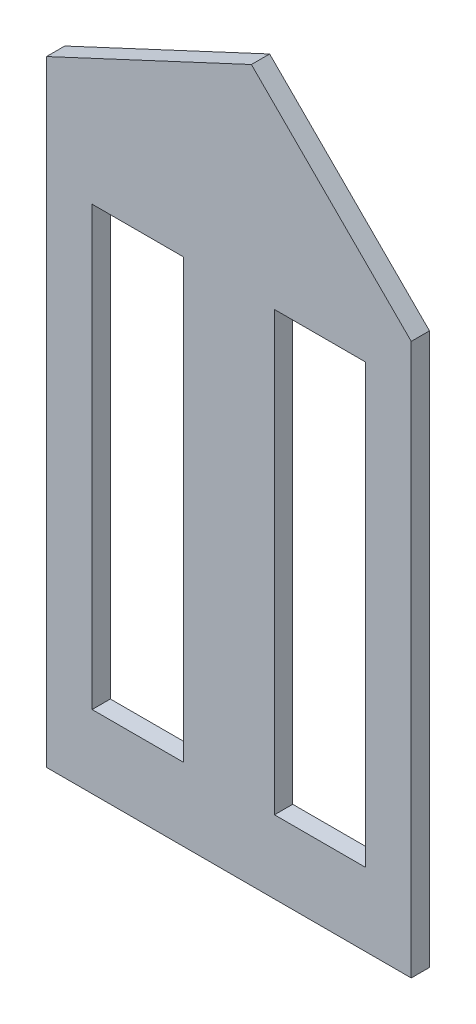
ISO-10303-21;
HEADER;
FILE_DESCRIPTION(('STEP AP214'),'2;1');
FILE_NAME('part.step','',(''),(''),'','','');
FILE_SCHEMA(('AUTOMOTIVE_DESIGN { 1 0 10303 214 1 1 1 1 }'));
ENDSEC;
DATA;
#1=APPLICATION_CONTEXT('core data for automotive mechanical design processes');
#2=APPLICATION_PROTOCOL_DEFINITION('international standard','automotive_design',2000,#1);
#3=PRODUCT_CONTEXT('',#1,'mechanical');
#4=PRODUCT('Part','Part','',(#3));
#5=PRODUCT_RELATED_PRODUCT_CATEGORY('part','',(#4));
#6=PRODUCT_DEFINITION_FORMATION('','',#4);
#7=PRODUCT_DEFINITION_CONTEXT('part definition',#1,'design');
#8=PRODUCT_DEFINITION('design','',#6,#7);
#9=PRODUCT_DEFINITION_SHAPE('','',#8);
#10=(LENGTH_UNIT() NAMED_UNIT(*) SI_UNIT(.MILLI.,.METRE.));
#11=(NAMED_UNIT(*) PLANE_ANGLE_UNIT() SI_UNIT($,.RADIAN.));
#12=(NAMED_UNIT(*) SI_UNIT($,.STERADIAN.) SOLID_ANGLE_UNIT());
#13=UNCERTAINTY_MEASURE_WITH_UNIT(LENGTH_MEASURE(1.E-05),#10,'distance_accuracy_value','');
#14=(GEOMETRIC_REPRESENTATION_CONTEXT(3) GLOBAL_UNCERTAINTY_ASSIGNED_CONTEXT((#13)) GLOBAL_UNIT_ASSIGNED_CONTEXT((#10,
#11,#12)) REPRESENTATION_CONTEXT('',''));
#15=CARTESIAN_POINT('',(0.,0.,0.));
#16=DIRECTION('',(0.,0.,1.));
#17=DIRECTION('',(1.,0.,0.));
#18=AXIS2_PLACEMENT_3D('',#15,#16,#17);
#19=CARTESIAN_POINT('',(0.,0.,6.35));
#20=DIRECTION('',(1.,0.,0.));
#21=DIRECTION('',(0.,0.,-1.));
#22=AXIS2_PLACEMENT_3D('',#19,#20,#21);
#23=PLANE('',#22);
#24=DIRECTION('',(0.,0.,1.));
#25=VECTOR('',#24,1.);
#26=CARTESIAN_POINT('',(0.,214.383772574386,0.));
#27=LINE('',#26,#25);
#28=CARTESIAN_POINT('',(0.,214.383772574386,0.));
#29=VERTEX_POINT('',#28);
#30=CARTESIAN_POINT('',(0.,214.383772574386,6.35));
#31=VERTEX_POINT('',#30);
#32=EDGE_CURVE('E229',#29,#31,#27,.T.);
#33=ORIENTED_EDGE('',*,*,#32,.F.);
#34=DIRECTION('',(0.,-1.,0.));
#35=VECTOR('',#34,1.);
#36=CARTESIAN_POINT('',(0.,0.,0.));
#37=LINE('',#36,#35);
#38=CARTESIAN_POINT('',(0.,0.,0.));
#39=VERTEX_POINT('',#38);
#40=EDGE_CURVE('E231',#29,#39,#37,.T.);
#41=ORIENTED_EDGE('',*,*,#40,.T.);
#42=DIRECTION('',(0.,0.,-1.));
#43=VECTOR('',#42,1.);
#44=CARTESIAN_POINT('',(0.,0.,6.35));
#45=LINE('',#44,#43);
#46=CARTESIAN_POINT('',(0.,0.,6.35));
#47=VERTEX_POINT('',#46);
#48=EDGE_CURVE('E12',#47,#39,#45,.T.);
#49=ORIENTED_EDGE('',*,*,#48,.F.);
#50=DIRECTION('',(0.,-1.,0.));
#51=VECTOR('',#50,1.);
#52=CARTESIAN_POINT('',(0.,0.,6.35));
#53=LINE('',#52,#51);
#54=EDGE_CURVE('E233',#31,#47,#53,.T.);
#55=ORIENTED_EDGE('',*,*,#54,.F.);
#56=EDGE_LOOP('',(#33,#41,#49,#55));
#57=FACE_BOUND('',#56,.T.);
#58=ADVANCED_FACE('F52',(#57),#23,.F.);
#59=CARTESIAN_POINT('',(0.,0.,6.35));
#60=DIRECTION('',(0.,0.,-1.));
#61=DIRECTION('',(-1.,0.,0.));
#62=AXIS2_PLACEMENT_3D('',#59,#60,#61);
#63=PLANE('',#62);
#64=DIRECTION('',(1.,0.,0.));
#65=VECTOR('',#64,1.);
#66=CARTESIAN_POINT('',(15.875,25.4,6.35));
#67=LINE('',#66,#65);
#68=CARTESIAN_POINT('',(15.875,25.4,6.35));
#69=VERTEX_POINT('',#68);
#70=CARTESIAN_POINT('',(47.625,25.4,6.35));
#71=VERTEX_POINT('',#70);
#72=EDGE_CURVE('E176',#69,#71,#67,.T.);
#73=ORIENTED_EDGE('',*,*,#72,.F.);
#74=DIRECTION('',(0.,-1.,0.));
#75=VECTOR('',#74,1.);
#76=CARTESIAN_POINT('',(15.875,177.8,6.35));
#77=LINE('',#76,#75);
#78=CARTESIAN_POINT('',(15.875,177.8,6.35));
#79=VERTEX_POINT('',#78);
#80=EDGE_CURVE('E66',#79,#69,#77,.T.);
#81=ORIENTED_EDGE('',*,*,#80,.F.);
#82=DIRECTION('',(-1.,0.,0.));
#83=VECTOR('',#82,1.);
#84=CARTESIAN_POINT('',(15.875,177.8,6.35));
#85=LINE('',#84,#83);
#86=CARTESIAN_POINT('',(47.625,177.8,6.35));
#87=VERTEX_POINT('',#86);
#88=EDGE_CURVE('E167',#87,#79,#85,.T.);
#89=ORIENTED_EDGE('',*,*,#88,.F.);
#90=DIRECTION('',(0.,1.,0.));
#91=VECTOR('',#90,1.);
#92=CARTESIAN_POINT('',(47.625,177.8,6.35));
#93=LINE('',#92,#91);
#94=EDGE_CURVE('E170',#71,#87,#93,.T.);
#95=ORIENTED_EDGE('',*,*,#94,.F.);
#96=EDGE_LOOP('',(#73,#81,#89,#95));
#97=FACE_BOUND('',#96,.T.);
#98=DIRECTION('',(1.,0.,0.));
#99=VECTOR('',#98,1.);
#100=CARTESIAN_POINT('',(79.375,25.4,6.35));
#101=LINE('',#100,#99);
#102=CARTESIAN_POINT('',(79.375,25.4,6.35));
#103=VERTEX_POINT('',#102);
#104=CARTESIAN_POINT('',(111.125,25.4,6.35));
#105=VERTEX_POINT('',#104);
#106=EDGE_CURVE('E202',#103,#105,#101,.T.);
#107=ORIENTED_EDGE('',*,*,#106,.F.);
#108=DIRECTION('',(0.,-1.,0.));
#109=VECTOR('',#108,1.);
#110=CARTESIAN_POINT('',(79.375,177.8,6.35));
#111=LINE('',#110,#109);
#112=CARTESIAN_POINT('',(79.375,177.8,6.35));
#113=VERTEX_POINT('',#112);
#114=EDGE_CURVE('E74',#113,#103,#111,.T.);
#115=ORIENTED_EDGE('',*,*,#114,.F.);
#116=DIRECTION('',(-1.,0.,0.));
#117=VECTOR('',#116,1.);
#118=CARTESIAN_POINT('',(79.375,177.8,6.35));
#119=LINE('',#118,#117);
#120=CARTESIAN_POINT('',(111.125,177.8,6.35));
#121=VERTEX_POINT('',#120);
#122=EDGE_CURVE('E191',#121,#113,#119,.T.);
#123=ORIENTED_EDGE('',*,*,#122,.F.);
#124=DIRECTION('',(0.,1.,0.));
#125=VECTOR('',#124,1.);
#126=CARTESIAN_POINT('',(111.125,177.8,6.35));
#127=LINE('',#126,#125);
#128=EDGE_CURVE('E205',#105,#121,#127,.T.);
#129=ORIENTED_EDGE('',*,*,#128,.F.);
#130=EDGE_LOOP('',(#107,#115,#123,#129));
#131=FACE_BOUND('',#130,.T.);
#132=DIRECTION('',(0.,1.,0.));
#133=VECTOR('',#132,1.);
#134=CARTESIAN_POINT('',(127.,0.,6.35));
#135=LINE('',#134,#133);
#136=CARTESIAN_POINT('',(127.,0.,6.35));
#137=VERTEX_POINT('',#136);
#138=CARTESIAN_POINT('',(127.,191.989654933476,6.35));
#139=VERTEX_POINT('',#138);
#140=EDGE_CURVE('E238',#137,#139,#135,.T.);
#141=ORIENTED_EDGE('',*,*,#140,.T.);
#142=DIRECTION('',(0.707106781186552,-0.707106781186544,0.));
#143=VECTOR('',#142,1.);
#144=CARTESIAN_POINT('',(159.494827466737,159.494827466739,6.35));
#145=LINE('',#144,#143);
#146=CARTESIAN_POINT('',(71.3396549334752,247.65,6.35));
#147=VERTEX_POINT('',#146);
#148=EDGE_CURVE('E183',#147,#139,#145,.T.);
#149=ORIENTED_EDGE('',*,*,#148,.F.);
#150=DIRECTION('',(-0.906307787036653,-0.422618261740693,0.));
#151=VECTOR('',#150,1.);
#152=CARTESIAN_POINT('',(-82.1137488377447,176.09350265153,6.35));
#153=LINE('',#152,#151);
#154=EDGE_CURVE('E223',#147,#31,#153,.T.);
#155=ORIENTED_EDGE('',*,*,#154,.T.);
#156=ORIENTED_EDGE('',*,*,#54,.T.);
#157=DIRECTION('',(1.,0.,0.));
#158=VECTOR('',#157,1.);
#159=CARTESIAN_POINT('',(0.,0.,6.35));
#160=LINE('',#159,#158);
#161=EDGE_CURVE('E235',#47,#137,#160,.T.);
#162=ORIENTED_EDGE('',*,*,#161,.T.);
#163=EDGE_LOOP('',(#141,#149,#155,#156,#162));
#164=FACE_BOUND('',#163,.T.);
#165=ADVANCED_FACE('F267',(#97,#131,#164),#63,.F.);
#166=CARTESIAN_POINT('',(0.,0.,0.));
#167=DIRECTION('',(0.,0.,-1.));
#168=DIRECTION('',(-1.,0.,0.));
#169=AXIS2_PLACEMENT_3D('',#166,#167,#168);
#170=PLANE('',#169);
#171=DIRECTION('',(0.,-1.,0.));
#172=VECTOR('',#171,1.);
#173=CARTESIAN_POINT('',(15.875,177.8,0.));
#174=LINE('',#173,#172);
#175=CARTESIAN_POINT('',(15.875,177.8,0.));
#176=VERTEX_POINT('',#175);
#177=CARTESIAN_POINT('',(15.875,25.4,0.));
#178=VERTEX_POINT('',#177);
#179=EDGE_CURVE('E148',#176,#178,#174,.T.);
#180=ORIENTED_EDGE('',*,*,#179,.T.);
#181=DIRECTION('',(1.,0.,0.));
#182=VECTOR('',#181,1.);
#183=CARTESIAN_POINT('',(15.875,25.4,0.));
#184=LINE('',#183,#182);
#185=CARTESIAN_POINT('',(47.625,25.4,0.));
#186=VERTEX_POINT('',#185);
#187=EDGE_CURVE('E158',#178,#186,#184,.T.);
#188=ORIENTED_EDGE('',*,*,#187,.T.);
#189=DIRECTION('',(0.,1.,0.));
#190=VECTOR('',#189,1.);
#191=CARTESIAN_POINT('',(47.625,177.8,0.));
#192=LINE('',#191,#190);
#193=CARTESIAN_POINT('',(47.625,177.8,0.));
#194=VERTEX_POINT('',#193);
#195=EDGE_CURVE('E162',#186,#194,#192,.T.);
#196=ORIENTED_EDGE('',*,*,#195,.T.);
#197=DIRECTION('',(-1.,0.,0.));
#198=VECTOR('',#197,1.);
#199=CARTESIAN_POINT('',(15.875,177.8,0.));
#200=LINE('',#199,#198);
#201=EDGE_CURVE('E154',#194,#176,#200,.T.);
#202=ORIENTED_EDGE('',*,*,#201,.T.);
#203=EDGE_LOOP('',(#180,#188,#196,#202));
#204=FACE_BOUND('',#203,.T.);
#205=DIRECTION('',(0.,-1.,0.));
#206=VECTOR('',#205,1.);
#207=CARTESIAN_POINT('',(79.375,177.8,0.));
#208=LINE('',#207,#206);
#209=CARTESIAN_POINT('',(79.375,177.8,0.));
#210=VERTEX_POINT('',#209);
#211=CARTESIAN_POINT('',(79.375,25.4,0.));
#212=VERTEX_POINT('',#211);
#213=EDGE_CURVE('E187',#210,#212,#208,.T.);
#214=ORIENTED_EDGE('',*,*,#213,.T.);
#215=DIRECTION('',(1.,0.,0.));
#216=VECTOR('',#215,1.);
#217=CARTESIAN_POINT('',(79.375,25.4,0.));
#218=LINE('',#217,#216);
#219=CARTESIAN_POINT('',(111.125,25.4,0.));
#220=VERTEX_POINT('',#219);
#221=EDGE_CURVE('E190',#212,#220,#218,.T.);
#222=ORIENTED_EDGE('',*,*,#221,.T.);
#223=DIRECTION('',(0.,1.,0.));
#224=VECTOR('',#223,1.);
#225=CARTESIAN_POINT('',(111.125,177.8,0.));
#226=LINE('',#225,#224);
#227=CARTESIAN_POINT('',(111.125,177.8,0.));
#228=VERTEX_POINT('',#227);
#229=EDGE_CURVE('E194',#220,#228,#226,.T.);
#230=ORIENTED_EDGE('',*,*,#229,.T.);
#231=DIRECTION('',(-1.,0.,0.));
#232=VECTOR('',#231,1.);
#233=CARTESIAN_POINT('',(79.375,177.8,0.));
#234=LINE('',#233,#232);
#235=EDGE_CURVE('E197',#228,#210,#234,.T.);
#236=ORIENTED_EDGE('',*,*,#235,.T.);
#237=EDGE_LOOP('',(#214,#222,#230,#236));
#238=FACE_BOUND('',#237,.T.);
#239=DIRECTION('',(0.707106781186552,-0.707106781186544,0.));
#240=VECTOR('',#239,1.);
#241=CARTESIAN_POINT('',(159.494827466737,159.494827466739,0.));
#242=LINE('',#241,#240);
#243=CARTESIAN_POINT('',(71.3396549334752,247.65,0.));
#244=VERTEX_POINT('',#243);
#245=CARTESIAN_POINT('',(127.,191.989654933476,0.));
#246=VERTEX_POINT('',#245);
#247=EDGE_CURVE('E216',#244,#246,#242,.T.);
#248=ORIENTED_EDGE('',*,*,#247,.T.);
#249=DIRECTION('',(0.,1.,0.));
#250=VECTOR('',#249,1.);
#251=CARTESIAN_POINT('',(127.,0.,0.));
#252=LINE('',#251,#250);
#253=CARTESIAN_POINT('',(127.,0.,0.));
#254=VERTEX_POINT('',#253);
#255=EDGE_CURVE('E236',#254,#246,#252,.T.);
#256=ORIENTED_EDGE('',*,*,#255,.F.);
#257=DIRECTION('',(1.,0.,0.));
#258=VECTOR('',#257,1.);
#259=CARTESIAN_POINT('',(0.,0.,0.));
#260=LINE('',#259,#258);
#261=EDGE_CURVE('E242',#39,#254,#260,.T.);
#262=ORIENTED_EDGE('',*,*,#261,.F.);
#263=ORIENTED_EDGE('',*,*,#40,.F.);
#264=DIRECTION('',(-0.906307787036653,-0.422618261740693,0.));
#265=VECTOR('',#264,1.);
#266=CARTESIAN_POINT('',(-82.1137488377447,176.09350265153,0.));
#267=LINE('',#266,#265);
#268=EDGE_CURVE('E224',#244,#29,#267,.T.);
#269=ORIENTED_EDGE('',*,*,#268,.F.);
#270=EDGE_LOOP('',(#248,#256,#262,#263,#269));
#271=FACE_BOUND('',#270,.T.);
#272=ADVANCED_FACE('F164',(#204,#238,#271),#170,.T.);
#273=CARTESIAN_POINT('',(0.,0.,6.35));
#274=DIRECTION('',(0.,1.,0.));
#275=DIRECTION('',(0.,0.,1.));
#276=AXIS2_PLACEMENT_3D('',#273,#274,#275);
#277=PLANE('',#276);
#278=ORIENTED_EDGE('',*,*,#261,.T.);
#279=DIRECTION('',(0.,0.,-1.));
#280=VECTOR('',#279,1.);
#281=CARTESIAN_POINT('',(127.,0.,6.35));
#282=LINE('',#281,#280);
#283=EDGE_CURVE('E59',#137,#254,#282,.T.);
#284=ORIENTED_EDGE('',*,*,#283,.F.);
#285=ORIENTED_EDGE('',*,*,#161,.F.);
#286=ORIENTED_EDGE('',*,*,#48,.T.);
#287=EDGE_LOOP('',(#278,#284,#285,#286));
#288=FACE_BOUND('',#287,.T.);
#289=ADVANCED_FACE('F270',(#288),#277,.F.);
#290=CARTESIAN_POINT('',(127.,0.,6.35));
#291=DIRECTION('',(-1.,0.,0.));
#292=DIRECTION('',(0.,0.,1.));
#293=AXIS2_PLACEMENT_3D('',#290,#291,#292);
#294=PLANE('',#293);
#295=ORIENTED_EDGE('',*,*,#255,.T.);
#296=DIRECTION('',(0.,0.,1.));
#297=VECTOR('',#296,1.);
#298=CARTESIAN_POINT('',(127.,191.989654933476,0.));
#299=LINE('',#298,#297);
#300=EDGE_CURVE('E219',#246,#139,#299,.T.);
#301=ORIENTED_EDGE('',*,*,#300,.T.);
#302=ORIENTED_EDGE('',*,*,#140,.F.);
#303=ORIENTED_EDGE('',*,*,#283,.T.);
#304=EDGE_LOOP('',(#295,#301,#302,#303));
#305=FACE_BOUND('',#304,.T.);
#306=ADVANCED_FACE('F250',(#305),#294,.F.);
#307=CARTESIAN_POINT('',(-82.1137488377447,176.09350265153,0.));
#308=DIRECTION('',(-0.422618261740693,0.906307787036653,0.));
#309=DIRECTION('',(-0.906307787036653,-0.422618261740693,0.));
#310=AXIS2_PLACEMENT_3D('',#307,#308,#309);
#311=PLANE('',#310);
#312=ORIENTED_EDGE('',*,*,#154,.F.);
#313=DIRECTION('',(0.,0.,1.));
#314=VECTOR('',#313,1.);
#315=CARTESIAN_POINT('',(71.3396549334752,247.65,0.));
#316=LINE('',#315,#314);
#317=EDGE_CURVE('E226',#244,#147,#316,.T.);
#318=ORIENTED_EDGE('',*,*,#317,.F.);
#319=ORIENTED_EDGE('',*,*,#268,.T.);
#320=ORIENTED_EDGE('',*,*,#32,.T.);
#321=EDGE_LOOP('',(#312,#318,#319,#320));
#322=FACE_BOUND('',#321,.T.);
#323=ADVANCED_FACE('F263',(#322),#311,.T.);
#324=CARTESIAN_POINT('',(159.494827466737,159.494827466739,0.));
#325=DIRECTION('',(-0.707106781186543,-0.707106781186551,0.));
#326=DIRECTION('',(0.707106781186551,-0.707106781186544,0.));
#327=AXIS2_PLACEMENT_3D('',#324,#325,#326);
#328=PLANE('',#327);
#329=ORIENTED_EDGE('',*,*,#148,.T.);
#330=ORIENTED_EDGE('',*,*,#300,.F.);
#331=ORIENTED_EDGE('',*,*,#247,.F.);
#332=ORIENTED_EDGE('',*,*,#317,.T.);
#333=EDGE_LOOP('',(#329,#330,#331,#332));
#334=FACE_BOUND('',#333,.T.);
#335=ADVANCED_FACE('F259',(#334),#328,.F.);
#336=CARTESIAN_POINT('',(79.375,177.8,0.));
#337=DIRECTION('',(-1.,0.,0.));
#338=DIRECTION('',(0.,-1.,0.));
#339=AXIS2_PLACEMENT_3D('',#336,#337,#338);
#340=PLANE('',#339);
#341=ORIENTED_EDGE('',*,*,#114,.T.);
#342=DIRECTION('',(0.,0.,1.));
#343=VECTOR('',#342,1.);
#344=CARTESIAN_POINT('',(79.375,25.4,0.));
#345=LINE('',#344,#343);
#346=EDGE_CURVE('E200',#212,#103,#345,.T.);
#347=ORIENTED_EDGE('',*,*,#346,.F.);
#348=ORIENTED_EDGE('',*,*,#213,.F.);
#349=DIRECTION('',(0.,0.,1.));
#350=VECTOR('',#349,1.);
#351=CARTESIAN_POINT('',(79.375,177.8,0.));
#352=LINE('',#351,#350);
#353=EDGE_CURVE('E177',#210,#113,#352,.T.);
#354=ORIENTED_EDGE('',*,*,#353,.T.);
#355=EDGE_LOOP('',(#341,#347,#348,#354));
#356=FACE_BOUND('',#355,.T.);
#357=ADVANCED_FACE('F292',(#356),#340,.F.);
#358=CARTESIAN_POINT('',(79.375,177.8,0.));
#359=DIRECTION('',(0.,1.,0.));
#360=DIRECTION('',(0.,0.,1.));
#361=AXIS2_PLACEMENT_3D('',#358,#359,#360);
#362=PLANE('',#361);
#363=ORIENTED_EDGE('',*,*,#122,.T.);
#364=ORIENTED_EDGE('',*,*,#353,.F.);
#365=ORIENTED_EDGE('',*,*,#235,.F.);
#366=DIRECTION('',(0.,0.,1.));
#367=VECTOR('',#366,1.);
#368=CARTESIAN_POINT('',(111.125,177.8,0.));
#369=LINE('',#368,#367);
#370=EDGE_CURVE('E211',#228,#121,#369,.T.);
#371=ORIENTED_EDGE('',*,*,#370,.T.);
#372=EDGE_LOOP('',(#363,#364,#365,#371));
#373=FACE_BOUND('',#372,.T.);
#374=ADVANCED_FACE('F295',(#373),#362,.F.);
#375=CARTESIAN_POINT('',(111.125,177.8,0.));
#376=DIRECTION('',(1.,0.,0.));
#377=DIRECTION('',(0.,1.,0.));
#378=AXIS2_PLACEMENT_3D('',#375,#376,#377);
#379=PLANE('',#378);
#380=ORIENTED_EDGE('',*,*,#128,.T.);
#381=ORIENTED_EDGE('',*,*,#370,.F.);
#382=ORIENTED_EDGE('',*,*,#229,.F.);
#383=DIRECTION('',(0.,0.,1.));
#384=VECTOR('',#383,1.);
#385=CARTESIAN_POINT('',(111.125,25.4,0.));
#386=LINE('',#385,#384);
#387=EDGE_CURVE('E213',#220,#105,#386,.T.);
#388=ORIENTED_EDGE('',*,*,#387,.T.);
#389=EDGE_LOOP('',(#380,#381,#382,#388));
#390=FACE_BOUND('',#389,.T.);
#391=ADVANCED_FACE('F299',(#390),#379,.F.);
#392=CARTESIAN_POINT('',(79.375,25.4,0.));
#393=DIRECTION('',(0.,-1.,0.));
#394=DIRECTION('',(1.,0.,0.));
#395=AXIS2_PLACEMENT_3D('',#392,#393,#394);
#396=PLANE('',#395);
#397=ORIENTED_EDGE('',*,*,#106,.T.);
#398=ORIENTED_EDGE('',*,*,#387,.F.);
#399=ORIENTED_EDGE('',*,*,#221,.F.);
#400=ORIENTED_EDGE('',*,*,#346,.T.);
#401=EDGE_LOOP('',(#397,#398,#399,#400));
#402=FACE_BOUND('',#401,.T.);
#403=ADVANCED_FACE('F296',(#402),#396,.F.);
#404=CARTESIAN_POINT('',(15.875,177.8,0.));
#405=DIRECTION('',(-1.,0.,0.));
#406=DIRECTION('',(0.,-1.,0.));
#407=AXIS2_PLACEMENT_3D('',#404,#405,#406);
#408=PLANE('',#407);
#409=ORIENTED_EDGE('',*,*,#80,.T.);
#410=DIRECTION('',(0.,0.,1.));
#411=VECTOR('',#410,1.);
#412=CARTESIAN_POINT('',(15.875,25.4,0.));
#413=LINE('',#412,#411);
#414=EDGE_CURVE('E144',#178,#69,#413,.T.);
#415=ORIENTED_EDGE('',*,*,#414,.F.);
#416=ORIENTED_EDGE('',*,*,#179,.F.);
#417=DIRECTION('',(0.,0.,1.));
#418=VECTOR('',#417,1.);
#419=CARTESIAN_POINT('',(15.875,177.8,0.));
#420=LINE('',#419,#418);
#421=EDGE_CURVE('E181',#176,#79,#420,.T.);
#422=ORIENTED_EDGE('',*,*,#421,.T.);
#423=EDGE_LOOP('',(#409,#415,#416,#422));
#424=FACE_BOUND('',#423,.T.);
#425=ADVANCED_FACE('F146',(#424),#408,.F.);
#426=CARTESIAN_POINT('',(15.875,177.8,0.));
#427=DIRECTION('',(0.,1.,0.));
#428=DIRECTION('',(0.,0.,1.));
#429=AXIS2_PLACEMENT_3D('',#426,#427,#428);
#430=PLANE('',#429);
#431=ORIENTED_EDGE('',*,*,#88,.T.);
#432=ORIENTED_EDGE('',*,*,#421,.F.);
#433=ORIENTED_EDGE('',*,*,#201,.F.);
#434=DIRECTION('',(0.,0.,1.));
#435=VECTOR('',#434,1.);
#436=CARTESIAN_POINT('',(47.625,177.8,0.));
#437=LINE('',#436,#435);
#438=EDGE_CURVE('E184',#194,#87,#437,.T.);
#439=ORIENTED_EDGE('',*,*,#438,.T.);
#440=EDGE_LOOP('',(#431,#432,#433,#439));
#441=FACE_BOUND('',#440,.T.);
#442=ADVANCED_FACE('F309',(#441),#430,.F.);
#443=CARTESIAN_POINT('',(47.625,177.8,0.));
#444=DIRECTION('',(1.,0.,0.));
#445=DIRECTION('',(0.,1.,0.));
#446=AXIS2_PLACEMENT_3D('',#443,#444,#445);
#447=PLANE('',#446);
#448=ORIENTED_EDGE('',*,*,#94,.T.);
#449=ORIENTED_EDGE('',*,*,#438,.F.);
#450=ORIENTED_EDGE('',*,*,#195,.F.);
#451=DIRECTION('',(0.,0.,1.));
#452=VECTOR('',#451,1.);
#453=CARTESIAN_POINT('',(47.625,25.4,0.));
#454=LINE('',#453,#452);
#455=EDGE_CURVE('E153',#186,#71,#454,.T.);
#456=ORIENTED_EDGE('',*,*,#455,.T.);
#457=EDGE_LOOP('',(#448,#449,#450,#456));
#458=FACE_BOUND('',#457,.T.);
#459=ADVANCED_FACE('F312',(#458),#447,.F.);
#460=CARTESIAN_POINT('',(15.875,25.4,0.));
#461=DIRECTION('',(0.,-1.,0.));
#462=DIRECTION('',(1.,0.,0.));
#463=AXIS2_PLACEMENT_3D('',#460,#461,#462);
#464=PLANE('',#463);
#465=ORIENTED_EDGE('',*,*,#72,.T.);
#466=ORIENTED_EDGE('',*,*,#455,.F.);
#467=ORIENTED_EDGE('',*,*,#187,.F.);
#468=ORIENTED_EDGE('',*,*,#414,.T.);
#469=EDGE_LOOP('',(#465,#466,#467,#468));
#470=FACE_BOUND('',#469,.T.);
#471=ADVANCED_FACE('F159',(#470),#464,.F.);
#472=CLOSED_SHELL('',(#58,#165,#272,#289,#306,#323,#335,#357,#374,#391,#403,#425,#442,#459,#471));
#473=MANIFOLD_SOLID_BREP('B2',#472);
#474=ADVANCED_BREP_SHAPE_REPRESENTATION('',(#18,#473),#14);
#475=SHAPE_DEFINITION_REPRESENTATION(#9,#474);
ENDSEC;
END-ISO-10303-21;
